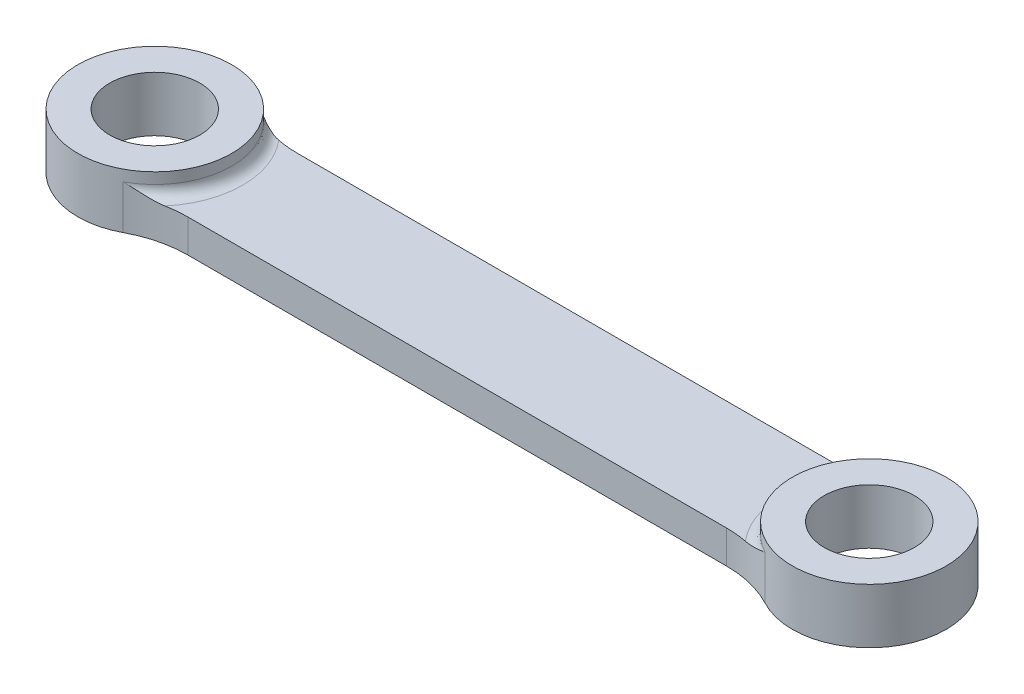
ISO-10303-21;
HEADER;
FILE_DESCRIPTION(('STEP AP214'),'2;1');
FILE_NAME('part.step','',(''),(''),'','','');
FILE_SCHEMA(('AUTOMOTIVE_DESIGN { 1 0 10303 214 1 1 1 1 }'));
ENDSEC;
DATA;
#1=APPLICATION_CONTEXT('core data for automotive mechanical design processes');
#2=APPLICATION_PROTOCOL_DEFINITION('international standard','automotive_design',2000,#1);
#3=PRODUCT_CONTEXT('',#1,'mechanical');
#4=PRODUCT('Part','Part','',(#3));
#5=PRODUCT_RELATED_PRODUCT_CATEGORY('part','',(#4));
#6=PRODUCT_DEFINITION_FORMATION('','',#4);
#7=PRODUCT_DEFINITION_CONTEXT('part definition',#1,'design');
#8=PRODUCT_DEFINITION('design','',#6,#7);
#9=PRODUCT_DEFINITION_SHAPE('','',#8);
#10=(LENGTH_UNIT() NAMED_UNIT(*) SI_UNIT(.MILLI.,.METRE.));
#11=(NAMED_UNIT(*) PLANE_ANGLE_UNIT() SI_UNIT($,.RADIAN.));
#12=(NAMED_UNIT(*) SI_UNIT($,.STERADIAN.) SOLID_ANGLE_UNIT());
#13=UNCERTAINTY_MEASURE_WITH_UNIT(LENGTH_MEASURE(1.E-05),#10,'distance_accuracy_value','');
#14=(GEOMETRIC_REPRESENTATION_CONTEXT(3) GLOBAL_UNCERTAINTY_ASSIGNED_CONTEXT((#13)) GLOBAL_UNIT_ASSIGNED_CONTEXT((#10,
#11,#12)) REPRESENTATION_CONTEXT('',''));
#15=CARTESIAN_POINT('',(0.,0.,0.));
#16=DIRECTION('',(0.,0.,1.));
#17=DIRECTION('',(1.,0.,0.));
#18=AXIS2_PLACEMENT_3D('',#15,#16,#17);
#19=CARTESIAN_POINT('',(0.,3.,5.));
#20=DIRECTION('',(0.,0.,-1.));
#21=DIRECTION('',(-1.,0.,0.));
#22=AXIS2_PLACEMENT_3D('',#19,#20,#21);
#23=PLANE('',#22);
#24=DIRECTION('',(1.,0.,0.));
#25=VECTOR('',#24,1.);
#26=CARTESIAN_POINT('',(0.,0.,5.));
#27=LINE('',#26,#25);
#28=CARTESIAN_POINT('',(8.,0.,5.));
#29=VERTEX_POINT('',#28);
#30=CARTESIAN_POINT('',(57.,0.,5.));
#31=VERTEX_POINT('',#30);
#32=EDGE_CURVE('E270',#29,#31,#27,.T.);
#33=ORIENTED_EDGE('',*,*,#32,.T.);
#34=DIRECTION('',(0.,-1.,0.));
#35=VECTOR('',#34,1.);
#36=CARTESIAN_POINT('',(57.,3.,5.));
#37=LINE('',#36,#35);
#38=CARTESIAN_POINT('',(57.,3.,5.));
#39=VERTEX_POINT('',#38);
#40=EDGE_CURVE('E174',#31,#39,#37,.F.);
#41=ORIENTED_EDGE('',*,*,#40,.T.);
#42=DIRECTION('',(1.,0.,0.));
#43=VECTOR('',#42,1.);
#44=CARTESIAN_POINT('',(0.,3.,5.));
#45=LINE('',#44,#43);
#46=CARTESIAN_POINT('',(8.,3.,5.));
#47=VERTEX_POINT('',#46);
#48=EDGE_CURVE('E149',#47,#39,#45,.T.);
#49=ORIENTED_EDGE('',*,*,#48,.F.);
#50=DIRECTION('',(0.,-1.,0.));
#51=VECTOR('',#50,1.);
#52=CARTESIAN_POINT('',(8.,3.,5.));
#53=LINE('',#52,#51);
#54=EDGE_CURVE('E170',#47,#29,#53,.T.);
#55=ORIENTED_EDGE('',*,*,#54,.T.);
#56=EDGE_LOOP('',(#33,#41,#49,#55));
#57=FACE_BOUND('',#56,.T.);
#58=ADVANCED_FACE('F39',(#57),#23,.F.);
#59=CARTESIAN_POINT('',(0.,3.,-5.));
#60=DIRECTION('',(0.,0.,1.));
#61=DIRECTION('',(1.,0.,0.));
#62=AXIS2_PLACEMENT_3D('',#59,#60,#61);
#63=PLANE('',#62);
#64=DIRECTION('',(-1.,0.,0.));
#65=VECTOR('',#64,1.);
#66=CARTESIAN_POINT('',(0.,0.,-5.));
#67=LINE('',#66,#65);
#68=CARTESIAN_POINT('',(57.,0.,-5.));
#69=VERTEX_POINT('',#68);
#70=CARTESIAN_POINT('',(8.,0.,-5.));
#71=VERTEX_POINT('',#70);
#72=EDGE_CURVE('E158',#69,#71,#67,.T.);
#73=ORIENTED_EDGE('',*,*,#72,.T.);
#74=DIRECTION('',(0.,-1.,0.));
#75=VECTOR('',#74,1.);
#76=CARTESIAN_POINT('',(8.,3.,-5.));
#77=LINE('',#76,#75);
#78=CARTESIAN_POINT('',(8.,3.,-5.));
#79=VERTEX_POINT('',#78);
#80=EDGE_CURVE('E147',#71,#79,#77,.F.);
#81=ORIENTED_EDGE('',*,*,#80,.T.);
#82=DIRECTION('',(-1.,0.,0.));
#83=VECTOR('',#82,1.);
#84=CARTESIAN_POINT('',(0.,3.,-5.));
#85=LINE('',#84,#83);
#86=CARTESIAN_POINT('',(57.,3.,-5.));
#87=VERTEX_POINT('',#86);
#88=EDGE_CURVE('E128',#87,#79,#85,.T.);
#89=ORIENTED_EDGE('',*,*,#88,.F.);
#90=DIRECTION('',(0.,-1.,0.));
#91=VECTOR('',#90,1.);
#92=CARTESIAN_POINT('',(57.,3.,-5.));
#93=LINE('',#92,#91);
#94=EDGE_CURVE('E144',#87,#69,#93,.T.);
#95=ORIENTED_EDGE('',*,*,#94,.T.);
#96=EDGE_LOOP('',(#73,#81,#89,#95));
#97=FACE_BOUND('',#96,.T.);
#98=ADVANCED_FACE('F143',(#97),#63,.F.);
#99=CARTESIAN_POINT('',(0.,3.,0.));
#100=DIRECTION('',(0.,1.,0.));
#101=DIRECTION('',(0.,0.,1.));
#102=AXIS2_PLACEMENT_3D('',#99,#100,#101);
#103=PLANE('',#102);
#104=CARTESIAN_POINT('',(8.,3.,-15.));
#105=DIRECTION('',(0.,1.,0.));
#106=DIRECTION('',(0.,0.,1.));
#107=AXIS2_PLACEMENT_3D('',#104,#105,#106);
#108=CIRCLE('',#107,10.);
#109=CARTESIAN_POINT('',(6.09363983850841,3.,-5.18339208612885));
#110=VERTEX_POINT('',#109);
#111=EDGE_CURVE('E178',#79,#110,#108,.F.);
#112=ORIENTED_EDGE('',*,*,#111,.T.);
#113=CARTESIAN_POINT('',(0.,3.,0.));
#114=DIRECTION('',(0.,1.,0.));
#115=DIRECTION('',(0.,0.,1.));
#116=AXIS2_PLACEMENT_3D('',#113,#114,#115);
#117=CIRCLE('',#116,8.);
#118=CARTESIAN_POINT('',(6.09363983850841,3.,5.18339208612885));
#119=VERTEX_POINT('',#118);
#120=EDGE_CURVE('E203',#110,#119,#117,.F.);
#121=ORIENTED_EDGE('',*,*,#120,.T.);
#122=CARTESIAN_POINT('',(8.,3.,15.));
#123=DIRECTION('',(0.,1.,0.));
#124=DIRECTION('',(0.,0.,1.));
#125=AXIS2_PLACEMENT_3D('',#122,#123,#124);
#126=CIRCLE('',#125,10.);
#127=EDGE_CURVE('E194',#119,#47,#126,.F.);
#128=ORIENTED_EDGE('',*,*,#127,.T.);
#129=ORIENTED_EDGE('',*,*,#48,.T.);
#130=CARTESIAN_POINT('',(57.,3.,15.));
#131=DIRECTION('',(0.,1.,0.));
#132=DIRECTION('',(0.,0.,1.));
#133=AXIS2_PLACEMENT_3D('',#130,#131,#132);
#134=CIRCLE('',#133,10.);
#135=CARTESIAN_POINT('',(58.9063601614916,3.,5.18339208612885));
#136=VERTEX_POINT('',#135);
#137=EDGE_CURVE('E136',#39,#136,#134,.F.);
#138=ORIENTED_EDGE('',*,*,#137,.T.);
#139=CARTESIAN_POINT('',(65.,3.,0.));
#140=DIRECTION('',(0.,1.,0.));
#141=DIRECTION('',(0.,0.,1.));
#142=AXIS2_PLACEMENT_3D('',#139,#140,#141);
#143=CIRCLE('',#142,8.);
#144=CARTESIAN_POINT('',(58.9063601614916,3.,-5.18339208612885));
#145=VERTEX_POINT('',#144);
#146=EDGE_CURVE('E131',#136,#145,#143,.F.);
#147=ORIENTED_EDGE('',*,*,#146,.T.);
#148=CARTESIAN_POINT('',(57.,3.,-15.));
#149=DIRECTION('',(0.,1.,0.));
#150=DIRECTION('',(0.,0.,1.));
#151=AXIS2_PLACEMENT_3D('',#148,#149,#150);
#152=CIRCLE('',#151,10.);
#153=EDGE_CURVE('E124',#145,#87,#152,.F.);
#154=ORIENTED_EDGE('',*,*,#153,.T.);
#155=ORIENTED_EDGE('',*,*,#88,.T.);
#156=EDGE_LOOP('',(#112,#121,#128,#129,#138,#147,#154,#155));
#157=FACE_BOUND('',#156,.T.);
#158=ADVANCED_FACE('F127',(#157),#103,.T.);
#159=CARTESIAN_POINT('',(0.,0.,0.));
#160=DIRECTION('',(0.,1.,0.));
#161=DIRECTION('',(0.,0.,1.));
#162=AXIS2_PLACEMENT_3D('',#159,#160,#161);
#163=PLANE('',#162);
#164=CARTESIAN_POINT('',(0.,0.,0.));
#165=DIRECTION('',(0.,1.,0.));
#166=DIRECTION('',(0.,0.,1.));
#167=AXIS2_PLACEMENT_3D('',#164,#165,#166);
#168=CIRCLE('',#167,4.1);
#169=CARTESIAN_POINT('',(0.,0.,4.1));
#170=VERTEX_POINT('',#169);
#171=EDGE_CURVE('E292',#170,#170,#168,.T.);
#172=ORIENTED_EDGE('',*,*,#171,.T.);
#173=EDGE_LOOP('',(#172));
#174=FACE_BOUND('',#173,.T.);
#175=CARTESIAN_POINT('',(65.,0.,0.));
#176=DIRECTION('',(0.,1.,0.));
#177=DIRECTION('',(0.,0.,1.));
#178=AXIS2_PLACEMENT_3D('',#175,#176,#177);
#179=CIRCLE('',#178,4.09999999999999);
#180=CARTESIAN_POINT('',(65.,0.,4.09999999999999));
#181=VERTEX_POINT('',#180);
#182=EDGE_CURVE('E302',#181,#181,#179,.T.);
#183=ORIENTED_EDGE('',*,*,#182,.T.);
#184=EDGE_LOOP('',(#183));
#185=FACE_BOUND('',#184,.T.);
#186=ORIENTED_EDGE('',*,*,#72,.F.);
#187=CARTESIAN_POINT('',(57.,0.,-15.));
#188=DIRECTION('',(0.,1.,0.));
#189=DIRECTION('',(0.,0.,1.));
#190=AXIS2_PLACEMENT_3D('',#187,#188,#189);
#191=CIRCLE('',#190,10.);
#192=CARTESIAN_POINT('',(61.7058823529412,0.,-6.17647058823529));
#193=VERTEX_POINT('',#192);
#194=EDGE_CURVE('E137',#69,#193,#191,.T.);
#195=ORIENTED_EDGE('',*,*,#194,.T.);
#196=CARTESIAN_POINT('',(65.,0.,0.));
#197=DIRECTION('',(0.,-1.,0.));
#198=DIRECTION('',(0.,0.,-1.));
#199=AXIS2_PLACEMENT_3D('',#196,#197,#198);
#200=CIRCLE('',#199,7.);
#201=CARTESIAN_POINT('',(61.7058823529412,0.,6.17647058823529));
#202=VERTEX_POINT('',#201);
#203=EDGE_CURVE('E273',#193,#202,#200,.T.);
#204=ORIENTED_EDGE('',*,*,#203,.T.);
#205=CARTESIAN_POINT('',(57.,0.,15.));
#206=DIRECTION('',(0.,1.,0.));
#207=DIRECTION('',(0.,0.,1.));
#208=AXIS2_PLACEMENT_3D('',#205,#206,#207);
#209=CIRCLE('',#208,10.);
#210=EDGE_CURVE('E188',#202,#31,#209,.T.);
#211=ORIENTED_EDGE('',*,*,#210,.T.);
#212=ORIENTED_EDGE('',*,*,#32,.F.);
#213=CARTESIAN_POINT('',(8.,0.,15.));
#214=DIRECTION('',(0.,1.,0.));
#215=DIRECTION('',(0.,0.,1.));
#216=AXIS2_PLACEMENT_3D('',#213,#214,#215);
#217=CIRCLE('',#216,10.);
#218=CARTESIAN_POINT('',(3.29411764705882,0.,6.17647058823529));
#219=VERTEX_POINT('',#218);
#220=EDGE_CURVE('E191',#29,#219,#217,.T.);
#221=ORIENTED_EDGE('',*,*,#220,.T.);
#222=CARTESIAN_POINT('',(0.,0.,0.));
#223=DIRECTION('',(0.,-1.,0.));
#224=DIRECTION('',(0.,0.,-1.));
#225=AXIS2_PLACEMENT_3D('',#222,#223,#224);
#226=CIRCLE('',#225,7.);
#227=CARTESIAN_POINT('',(3.29411764705882,0.,-6.17647058823529));
#228=VERTEX_POINT('',#227);
#229=EDGE_CURVE('E260',#219,#228,#226,.T.);
#230=ORIENTED_EDGE('',*,*,#229,.T.);
#231=CARTESIAN_POINT('',(8.,0.,-15.));
#232=DIRECTION('',(0.,1.,0.));
#233=DIRECTION('',(0.,0.,1.));
#234=AXIS2_PLACEMENT_3D('',#231,#232,#233);
#235=CIRCLE('',#234,10.);
#236=EDGE_CURVE('E181',#228,#71,#235,.T.);
#237=ORIENTED_EDGE('',*,*,#236,.T.);
#238=EDGE_LOOP('',(#186,#195,#204,#211,#212,#221,#230,#237));
#239=FACE_BOUND('',#238,.T.);
#240=ADVANCED_FACE('F286',(#174,#185,#239),#163,.F.);
#241=CARTESIAN_POINT('',(0.,5.,0.));
#242=DIRECTION('',(0.,-1.,0.));
#243=DIRECTION('',(0.,0.,-1.));
#244=AXIS2_PLACEMENT_3D('',#241,#242,#243);
#245=CYLINDRICAL_SURFACE('',#244,7.);
#246=CARTESIAN_POINT('',(0.,5.,0.));
#247=DIRECTION('',(0.,-1.,0.));
#248=DIRECTION('',(0.,0.,-1.));
#249=AXIS2_PLACEMENT_3D('',#246,#247,#248);
#250=CIRCLE('',#249,7.);
#251=CARTESIAN_POINT('',(0.,5.,-7.));
#252=VERTEX_POINT('',#251);
#253=EDGE_CURVE('E264',#252,#252,#250,.T.);
#254=ORIENTED_EDGE('',*,*,#253,.T.);
#255=EDGE_LOOP('',(#254));
#256=FACE_BOUND('',#255,.T.);
#257=CARTESIAN_POINT('',(0.,4.,0.));
#258=DIRECTION('',(0.,1.,0.));
#259=DIRECTION('',(0.,0.,1.));
#260=AXIS2_PLACEMENT_3D('',#257,#258,#259);
#261=CIRCLE('',#260,7.);
#262=CARTESIAN_POINT('',(3.29411764705882,4.,6.17647058823529));
#263=VERTEX_POINT('',#262);
#264=CARTESIAN_POINT('',(3.29411764705882,4.,-6.17647058823529));
#265=VERTEX_POINT('',#264);
#266=EDGE_CURVE('E197',#263,#265,#261,.T.);
#267=ORIENTED_EDGE('',*,*,#266,.T.);
#268=DIRECTION('',(0.,-1.,0.));
#269=VECTOR('',#268,1.);
#270=CARTESIAN_POINT('',(3.29411764705882,5.,-6.17647058823529));
#271=LINE('',#270,#269);
#272=EDGE_CURVE('E163',#265,#228,#271,.T.);
#273=ORIENTED_EDGE('',*,*,#272,.T.);
#274=ORIENTED_EDGE('',*,*,#229,.F.);
#275=DIRECTION('',(0.,-1.,0.));
#276=VECTOR('',#275,1.);
#277=CARTESIAN_POINT('',(3.29411764705882,5.,6.17647058823529));
#278=LINE('',#277,#276);
#279=EDGE_CURVE('E155',#219,#263,#278,.F.);
#280=ORIENTED_EDGE('',*,*,#279,.T.);
#281=EDGE_LOOP('',(#267,#273,#274,#280));
#282=FACE_BOUND('',#281,.T.);
#283=ADVANCED_FACE('F257',(#256,#282),#245,.T.);
#284=CARTESIAN_POINT('',(0.,5.,0.));
#285=DIRECTION('',(0.,-1.,0.));
#286=DIRECTION('',(0.,0.,-1.));
#287=AXIS2_PLACEMENT_3D('',#284,#285,#286);
#288=PLANE('',#287);
#289=CARTESIAN_POINT('',(0.,5.,0.));
#290=DIRECTION('',(0.,1.,0.));
#291=DIRECTION('',(0.,0.,1.));
#292=AXIS2_PLACEMENT_3D('',#289,#290,#291);
#293=CIRCLE('',#292,4.1);
#294=CARTESIAN_POINT('',(0.,5.,4.1));
#295=VERTEX_POINT('',#294);
#296=EDGE_CURVE('E295',#295,#295,#293,.T.);
#297=ORIENTED_EDGE('',*,*,#296,.F.);
#298=EDGE_LOOP('',(#297));
#299=FACE_BOUND('',#298,.T.);
#300=ORIENTED_EDGE('',*,*,#253,.F.);
#301=EDGE_LOOP('',(#300));
#302=FACE_BOUND('',#301,.T.);
#303=ADVANCED_FACE('F311',(#299,#302),#288,.F.);
#304=CARTESIAN_POINT('',(65.,5.,0.));
#305=DIRECTION('',(0.,-1.,0.));
#306=DIRECTION('',(0.,0.,-1.));
#307=AXIS2_PLACEMENT_3D('',#304,#305,#306);
#308=CYLINDRICAL_SURFACE('',#307,7.);
#309=CARTESIAN_POINT('',(65.,5.,0.));
#310=DIRECTION('',(0.,-1.,0.));
#311=DIRECTION('',(0.,0.,-1.));
#312=AXIS2_PLACEMENT_3D('',#309,#310,#311);
#313=CIRCLE('',#312,7.);
#314=CARTESIAN_POINT('',(65.,5.,-7.));
#315=VERTEX_POINT('',#314);
#316=EDGE_CURVE('E265',#315,#315,#313,.T.);
#317=ORIENTED_EDGE('',*,*,#316,.T.);
#318=EDGE_LOOP('',(#317));
#319=FACE_BOUND('',#318,.T.);
#320=CARTESIAN_POINT('',(65.,4.,0.));
#321=DIRECTION('',(0.,1.,0.));
#322=DIRECTION('',(0.,0.,1.));
#323=AXIS2_PLACEMENT_3D('',#320,#321,#322);
#324=CIRCLE('',#323,7.);
#325=CARTESIAN_POINT('',(61.7058823529412,4.,-6.17647058823529));
#326=VERTEX_POINT('',#325);
#327=CARTESIAN_POINT('',(61.7058823529412,4.,6.17647058823529));
#328=VERTEX_POINT('',#327);
#329=EDGE_CURVE('E206',#326,#328,#324,.T.);
#330=ORIENTED_EDGE('',*,*,#329,.T.);
#331=DIRECTION('',(0.,-1.,0.));
#332=VECTOR('',#331,1.);
#333=CARTESIAN_POINT('',(61.7058823529412,5.,6.17647058823529));
#334=LINE('',#333,#332);
#335=EDGE_CURVE('E61',#328,#202,#334,.T.);
#336=ORIENTED_EDGE('',*,*,#335,.T.);
#337=ORIENTED_EDGE('',*,*,#203,.F.);
#338=DIRECTION('',(0.,-1.,0.));
#339=VECTOR('',#338,1.);
#340=CARTESIAN_POINT('',(61.7058823529412,5.,-6.17647058823529));
#341=LINE('',#340,#339);
#342=EDGE_CURVE('E69',#193,#326,#341,.F.);
#343=ORIENTED_EDGE('',*,*,#342,.T.);
#344=EDGE_LOOP('',(#330,#336,#337,#343));
#345=FACE_BOUND('',#344,.T.);
#346=ADVANCED_FACE('F290',(#319,#345),#308,.T.);
#347=CARTESIAN_POINT('',(65.,5.,0.));
#348=DIRECTION('',(0.,-1.,0.));
#349=DIRECTION('',(0.,0.,-1.));
#350=AXIS2_PLACEMENT_3D('',#347,#348,#349);
#351=PLANE('',#350);
#352=CARTESIAN_POINT('',(65.,5.,0.));
#353=DIRECTION('',(0.,1.,0.));
#354=DIRECTION('',(0.,0.,1.));
#355=AXIS2_PLACEMENT_3D('',#352,#353,#354);
#356=CIRCLE('',#355,4.09999999999999);
#357=CARTESIAN_POINT('',(65.,5.,4.09999999999999));
#358=VERTEX_POINT('',#357);
#359=EDGE_CURVE('E298',#358,#358,#356,.T.);
#360=ORIENTED_EDGE('',*,*,#359,.F.);
#361=EDGE_LOOP('',(#360));
#362=FACE_BOUND('',#361,.T.);
#363=ORIENTED_EDGE('',*,*,#316,.F.);
#364=EDGE_LOOP('',(#363));
#365=FACE_BOUND('',#364,.T.);
#366=ADVANCED_FACE('F368',(#362,#365),#351,.F.);
#367=CARTESIAN_POINT('',(65.,0.,0.));
#368=DIRECTION('',(0.,1.,0.));
#369=DIRECTION('',(0.,0.,1.));
#370=AXIS2_PLACEMENT_3D('',#367,#368,#369);
#371=CYLINDRICAL_SURFACE('',#370,4.09999999999999);
#372=ORIENTED_EDGE('',*,*,#182,.F.);
#373=EDGE_LOOP('',(#372));
#374=FACE_BOUND('',#373,.T.);
#375=ORIENTED_EDGE('',*,*,#359,.T.);
#376=EDGE_LOOP('',(#375));
#377=FACE_BOUND('',#376,.T.);
#378=ADVANCED_FACE('F357',(#374,#377),#371,.F.);
#379=CARTESIAN_POINT('',(0.,0.,0.));
#380=DIRECTION('',(0.,1.,0.));
#381=DIRECTION('',(0.,0.,1.));
#382=AXIS2_PLACEMENT_3D('',#379,#380,#381);
#383=CYLINDRICAL_SURFACE('',#382,4.1);
#384=ORIENTED_EDGE('',*,*,#171,.F.);
#385=EDGE_LOOP('',(#384));
#386=FACE_BOUND('',#385,.T.);
#387=ORIENTED_EDGE('',*,*,#296,.T.);
#388=EDGE_LOOP('',(#387));
#389=FACE_BOUND('',#388,.T.);
#390=ADVANCED_FACE('F229',(#386,#389),#383,.F.);
#391=CARTESIAN_POINT('',(8.,5.,-15.));
#392=DIRECTION('',(0.,-1.,0.));
#393=DIRECTION('',(0.,0.,-1.));
#394=AXIS2_PLACEMENT_3D('',#391,#392,#393);
#395=CYLINDRICAL_SURFACE('',#394,10.);
#396=ORIENTED_EDGE('',*,*,#236,.F.);
#397=ORIENTED_EDGE('',*,*,#272,.F.);
#398=CARTESIAN_POINT('',(6.09363983850841,3.,-5.18339208612885));
#399=CARTESIAN_POINT('',(6.01229362301277,3.00003993141161,-5.19918239722036));
#400=CARTESIAN_POINT('',(5.93125376245009,3.00400904111718,-5.21597590640248));
#401=CARTESIAN_POINT('',(5.77035463726669,3.01860270532805,-5.25138909842975));
#402=CARTESIAN_POINT('',(5.69049313076267,3.02921229926778,-5.27000459713531));
#403=CARTESIAN_POINT('',(5.53296898567861,3.05575684656951,-5.30875223332345));
#404=CARTESIAN_POINT('',(5.45529214621504,3.07163557066252,-5.32886668793732));
#405=CARTESIAN_POINT('',(5.30137835440672,3.10786047996514,-5.37068005933332));
#406=CARTESIAN_POINT('',(5.225142404779,3.12820966023958,-5.39238003182623));
#407=CARTESIAN_POINT('',(4.98323406785799,3.19932604177595,-5.4643153492549));
#408=CARTESIAN_POINT('',(4.82049883655063,3.25719715683663,-5.51742400262594));
#409=CARTESIAN_POINT('',(4.50199831849837,3.38449962358436,-5.63022983403955));
#410=CARTESIAN_POINT('',(4.34624031556413,3.45394271458532,-5.68993368170001));
#411=CARTESIAN_POINT('',(4.03995802957932,3.60018595888872,-5.81601254443267));
#412=CARTESIAN_POINT('',(3.88946428722354,3.67702162941357,-5.88241984941489));
#413=CARTESIAN_POINT('',(3.59344355357407,3.83400689983837,-6.02174800181973));
#414=CARTESIAN_POINT('',(3.44791394392138,3.91415470180985,-6.09466533970433));
#415=CARTESIAN_POINT('',(3.30089033859922,3.99621794959413,-6.17286099681611));
#416=CARTESIAN_POINT('',(3.29750346958294,3.99810897883892,-6.17466482414208));
#417=CARTESIAN_POINT('',(3.29411764705882,4.,-6.17647058823529));
#418=B_SPLINE_CURVE_WITH_KNOTS('',3,(#398,#399,#400,#401,#402,#403,#404,#405,#406,#407,#408,
#409,#410,#411,#412,#413,#414,#415,#416,#417),.UNSPECIFIED.,.F.,.F.,(4,2,2,2,2,2,2,2,2,4),(0.,
0.248338874095087,0.496120261372776,0.741338216257405,0.986720963207811,1.52781999699019,
2.06947133396864,2.61386900151935,3.1579749380017,3.1708087186707),.UNSPECIFIED.);
#419=EDGE_CURVE('E209',#265,#110,#418,.F.);
#420=ORIENTED_EDGE('',*,*,#419,.T.);
#421=ORIENTED_EDGE('',*,*,#111,.F.);
#422=ORIENTED_EDGE('',*,*,#80,.F.);
#423=EDGE_LOOP('',(#396,#397,#420,#421,#422));
#424=FACE_BOUND('',#423,.T.);
#425=ADVANCED_FACE('F225',(#424),#395,.F.);
#426=CARTESIAN_POINT('',(57.,5.,-15.));
#427=DIRECTION('',(0.,-1.,0.));
#428=DIRECTION('',(0.,0.,-1.));
#429=AXIS2_PLACEMENT_3D('',#426,#427,#428);
#430=CYLINDRICAL_SURFACE('',#429,10.);
#431=ORIENTED_EDGE('',*,*,#153,.F.);
#432=CARTESIAN_POINT('',(58.9063601614916,3.,-5.18339208612885));
#433=CARTESIAN_POINT('',(58.9877063769873,3.00003993141161,-5.19918239722037));
#434=CARTESIAN_POINT('',(59.06874623755,3.00400904111719,-5.21597590640251));
#435=CARTESIAN_POINT('',(59.2296453627335,3.01860270532807,-5.2513890984298));
#436=CARTESIAN_POINT('',(59.3095068692376,3.02921229926781,-5.27000459713537));
#437=CARTESIAN_POINT('',(59.4670310143216,3.05575684656955,-5.30875223332351));
#438=CARTESIAN_POINT('',(59.5447078537851,3.07163557066256,-5.32886668793737));
#439=CARTESIAN_POINT('',(59.6986216455934,3.10786047996516,-5.37068005933334));
#440=CARTESIAN_POINT('',(59.7748575952211,3.12820966023959,-5.39238003182624));
#441=CARTESIAN_POINT('',(60.016765932142,3.19932604177594,-5.4643153492549));
#442=CARTESIAN_POINT('',(60.1795011634494,3.25719715683659,-5.51742400262594));
#443=CARTESIAN_POINT('',(60.4980016815016,3.38449962358437,-5.63022983403952));
#444=CARTESIAN_POINT('',(60.6537596844357,3.45394271458541,-5.68993368169994));
#445=CARTESIAN_POINT('',(60.9600419704206,3.60018595888854,-5.81601254443265));
#446=CARTESIAN_POINT('',(61.1105357127766,3.67702162941304,-5.88241984941497));
#447=CARTESIAN_POINT('',(61.4065564464257,3.83400689983885,-6.02174800181961));
#448=CARTESIAN_POINT('',(61.5520860560778,3.9141547018117,-6.09466533970392));
#449=CARTESIAN_POINT('',(61.6991096614008,3.99621794959423,-6.1728609968161));
#450=CARTESIAN_POINT('',(61.7024965304171,3.99810897883897,-6.17466482414208));
#451=CARTESIAN_POINT('',(61.7058823529412,4.,-6.17647058823529));
#452=B_SPLINE_CURVE_WITH_KNOTS('',3,(#432,#433,#434,#435,#436,#437,#438,#439,#440,#441,#442,
#443,#444,#445,#446,#447,#448,#449,#450,#451),.UNSPECIFIED.,.F.,.F.,(4,2,2,2,2,2,2,2,2,4),(0.,
0.24833887409525,0.496120261373071,0.741338216257543,0.986720963207814,1.52781999699016,
2.0694713339685,2.61386900151929,3.15797493800176,3.1708087186707),.UNSPECIFIED.);
#453=EDGE_CURVE('E11',#145,#326,#452,.T.);
#454=ORIENTED_EDGE('',*,*,#453,.T.);
#455=ORIENTED_EDGE('',*,*,#342,.F.);
#456=ORIENTED_EDGE('',*,*,#194,.F.);
#457=ORIENTED_EDGE('',*,*,#94,.F.);
#458=EDGE_LOOP('',(#431,#454,#455,#456,#457));
#459=FACE_BOUND('',#458,.T.);
#460=ADVANCED_FACE('F151',(#459),#430,.F.);
#461=CARTESIAN_POINT('',(57.,5.,15.));
#462=DIRECTION('',(0.,-1.,0.));
#463=DIRECTION('',(0.,0.,-1.));
#464=AXIS2_PLACEMENT_3D('',#461,#462,#463);
#465=CYLINDRICAL_SURFACE('',#464,10.);
#466=ORIENTED_EDGE('',*,*,#210,.F.);
#467=ORIENTED_EDGE('',*,*,#335,.F.);
#468=CARTESIAN_POINT('',(58.9063601614916,3.,5.18339208612885));
#469=CARTESIAN_POINT('',(58.9877063769873,3.00003993141161,5.19918239722037));
#470=CARTESIAN_POINT('',(59.06874623755,3.00400904111719,5.21597590640251));
#471=CARTESIAN_POINT('',(59.2296453627335,3.01860270532807,5.2513890984298));
#472=CARTESIAN_POINT('',(59.3095068692376,3.02921229926781,5.27000459713537));
#473=CARTESIAN_POINT('',(59.4670310143216,3.05575684656955,5.30875223332351));
#474=CARTESIAN_POINT('',(59.5447078537851,3.07163557066256,5.32886668793737));
#475=CARTESIAN_POINT('',(59.6986216455934,3.10786047996516,5.37068005933334));
#476=CARTESIAN_POINT('',(59.7748575952211,3.12820966023959,5.39238003182624));
#477=CARTESIAN_POINT('',(60.016765932142,3.19932604177594,5.4643153492549));
#478=CARTESIAN_POINT('',(60.1795011634494,3.25719715683659,5.51742400262594));
#479=CARTESIAN_POINT('',(60.4980016815016,3.38449962358437,5.63022983403952));
#480=CARTESIAN_POINT('',(60.6537596844357,3.45394271458541,5.68993368169994));
#481=CARTESIAN_POINT('',(60.9600419704206,3.60018595888854,5.81601254443265));
#482=CARTESIAN_POINT('',(61.1105357127766,3.67702162941304,5.88241984941497));
#483=CARTESIAN_POINT('',(61.4065564464257,3.83400689983885,6.02174800181961));
#484=CARTESIAN_POINT('',(61.5520860560778,3.9141547018117,6.09466533970392));
#485=CARTESIAN_POINT('',(61.6991096614008,3.99621794959423,6.1728609968161));
#486=CARTESIAN_POINT('',(61.7024965304171,3.99810897883897,6.17466482414208));
#487=CARTESIAN_POINT('',(61.7058823529412,4.,6.17647058823529));
#488=B_SPLINE_CURVE_WITH_KNOTS('',3,(#468,#469,#470,#471,#472,#473,#474,#475,#476,#477,#478,
#479,#480,#481,#482,#483,#484,#485,#486,#487),.UNSPECIFIED.,.F.,.F.,(4,2,2,2,2,2,2,2,2,4),(0.,
0.24833887409525,0.496120261373071,0.741338216257543,0.986720963207814,1.52781999699016,
2.0694713339685,2.61386900151929,3.15797493800176,3.1708087186707),.UNSPECIFIED.);
#489=EDGE_CURVE('E54',#328,#136,#488,.F.);
#490=ORIENTED_EDGE('',*,*,#489,.T.);
#491=ORIENTED_EDGE('',*,*,#137,.F.);
#492=ORIENTED_EDGE('',*,*,#40,.F.);
#493=EDGE_LOOP('',(#466,#467,#490,#491,#492));
#494=FACE_BOUND('',#493,.T.);
#495=ADVANCED_FACE('F235',(#494),#465,.F.);
#496=CARTESIAN_POINT('',(8.,5.,15.));
#497=DIRECTION('',(0.,-1.,0.));
#498=DIRECTION('',(0.,0.,-1.));
#499=AXIS2_PLACEMENT_3D('',#496,#497,#498);
#500=CYLINDRICAL_SURFACE('',#499,10.);
#501=ORIENTED_EDGE('',*,*,#127,.F.);
#502=CARTESIAN_POINT('',(6.09363983850841,3.,5.18339208612885));
#503=CARTESIAN_POINT('',(6.01229362301277,3.00003993141161,5.19918239722036));
#504=CARTESIAN_POINT('',(5.93125376245009,3.00400904111718,5.21597590640248));
#505=CARTESIAN_POINT('',(5.77035463726669,3.01860270532805,5.25138909842975));
#506=CARTESIAN_POINT('',(5.69049313076267,3.02921229926778,5.27000459713531));
#507=CARTESIAN_POINT('',(5.53296898567861,3.05575684656951,5.30875223332345));
#508=CARTESIAN_POINT('',(5.45529214621504,3.07163557066252,5.32886668793732));
#509=CARTESIAN_POINT('',(5.30137835440672,3.10786047996514,5.37068005933332));
#510=CARTESIAN_POINT('',(5.225142404779,3.12820966023958,5.39238003182623));
#511=CARTESIAN_POINT('',(4.98323406785799,3.19932604177595,5.4643153492549));
#512=CARTESIAN_POINT('',(4.82049883655063,3.25719715683663,5.51742400262594));
#513=CARTESIAN_POINT('',(4.50199831849837,3.38449962358436,5.63022983403955));
#514=CARTESIAN_POINT('',(4.34624031556413,3.45394271458532,5.68993368170001));
#515=CARTESIAN_POINT('',(4.03995802957932,3.60018595888872,5.81601254443267));
#516=CARTESIAN_POINT('',(3.88946428722354,3.67702162941357,5.88241984941489));
#517=CARTESIAN_POINT('',(3.59344355357407,3.83400689983837,6.02174800181973));
#518=CARTESIAN_POINT('',(3.44791394392138,3.91415470180985,6.09466533970433));
#519=CARTESIAN_POINT('',(3.30089033859922,3.99621794959413,6.17286099681611));
#520=CARTESIAN_POINT('',(3.29750346958294,3.99810897883892,6.17466482414208));
#521=CARTESIAN_POINT('',(3.29411764705882,4.,6.17647058823529));
#522=B_SPLINE_CURVE_WITH_KNOTS('',3,(#502,#503,#504,#505,#506,#507,#508,#509,#510,#511,#512,
#513,#514,#515,#516,#517,#518,#519,#520,#521),.UNSPECIFIED.,.F.,.F.,(4,2,2,2,2,2,2,2,2,4),(0.,
0.248338874095087,0.496120261372776,0.741338216257405,0.986720963207811,1.52781999699019,
2.06947133396864,2.61386900151935,3.1579749380017,3.1708087186707),.UNSPECIFIED.);
#523=EDGE_CURVE('E217',#119,#263,#522,.T.);
#524=ORIENTED_EDGE('',*,*,#523,.T.);
#525=ORIENTED_EDGE('',*,*,#279,.F.);
#526=ORIENTED_EDGE('',*,*,#220,.F.);
#527=ORIENTED_EDGE('',*,*,#54,.F.);
#528=EDGE_LOOP('',(#501,#524,#525,#526,#527));
#529=FACE_BOUND('',#528,.T.);
#530=ADVANCED_FACE('F238',(#529),#500,.F.);
#531=CARTESIAN_POINT('',(0.,4.,0.));
#532=DIRECTION('',(0.,1.,0.));
#533=DIRECTION('',(0.,0.,1.));
#534=AXIS2_PLACEMENT_3D('',#531,#532,#533);
#535=TOROIDAL_SURFACE('',#534,8.,1.);
#536=ORIENTED_EDGE('',*,*,#523,.F.);
#537=ORIENTED_EDGE('',*,*,#120,.F.);
#538=ORIENTED_EDGE('',*,*,#419,.F.);
#539=ORIENTED_EDGE('',*,*,#266,.F.);
#540=EDGE_LOOP('',(#536,#537,#538,#539));
#541=FACE_BOUND('',#540,.T.);
#542=ADVANCED_FACE('F223',(#541),#535,.F.);
#543=CARTESIAN_POINT('',(65.,4.,0.));
#544=DIRECTION('',(0.,1.,0.));
#545=DIRECTION('',(0.,0.,1.));
#546=AXIS2_PLACEMENT_3D('',#543,#544,#545);
#547=TOROIDAL_SURFACE('',#546,8.,1.);
#548=ORIENTED_EDGE('',*,*,#453,.F.);
#549=ORIENTED_EDGE('',*,*,#146,.F.);
#550=ORIENTED_EDGE('',*,*,#489,.F.);
#551=ORIENTED_EDGE('',*,*,#329,.F.);
#552=EDGE_LOOP('',(#548,#549,#550,#551));
#553=FACE_BOUND('',#552,.T.);
#554=ADVANCED_FACE('F41',(#553),#547,.F.);
#555=CLOSED_SHELL('',(#58,#98,#158,#240,#283,#303,#346,#366,#378,#390,#425,#460,#495,#530,#542,#554));
#556=MANIFOLD_SOLID_BREP('B2',#555);
#557=ADVANCED_BREP_SHAPE_REPRESENTATION('',(#18,#556),#14);
#558=SHAPE_DEFINITION_REPRESENTATION(#9,#557);
ENDSEC;
END-ISO-10303-21;
